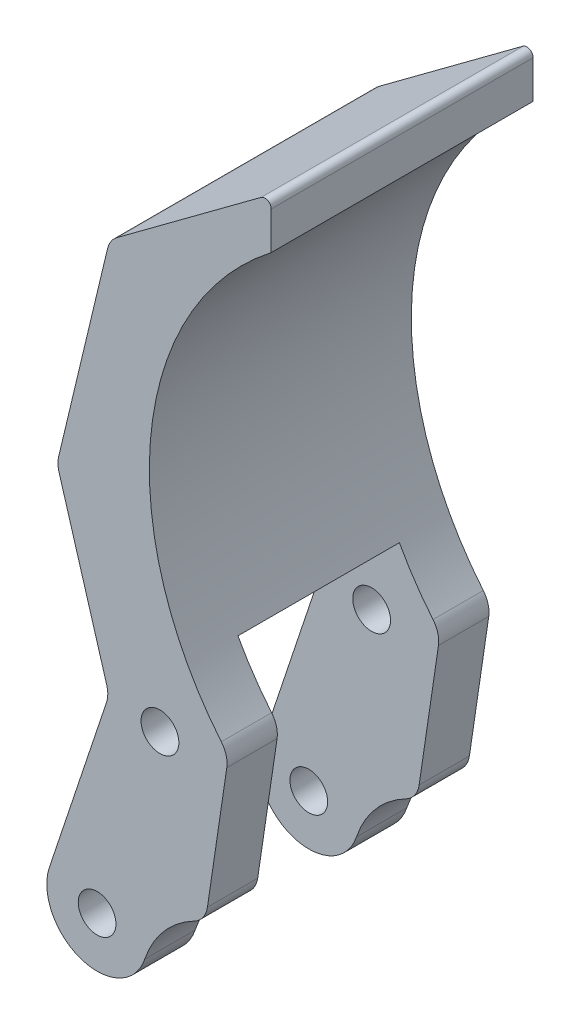
ISO-10303-21;
HEADER;
FILE_DESCRIPTION(('STEP AP214'),'2;1');
FILE_NAME('part.step','',(''),(''),'','','');
FILE_SCHEMA(('AUTOMOTIVE_DESIGN { 1 0 10303 214 1 1 1 1 }'));
ENDSEC;
DATA;
#1=APPLICATION_CONTEXT('core data for automotive mechanical design processes');
#2=APPLICATION_PROTOCOL_DEFINITION('international standard','automotive_design',2000,#1);
#3=PRODUCT_CONTEXT('',#1,'mechanical');
#4=PRODUCT('Part','Part','',(#3));
#5=PRODUCT_RELATED_PRODUCT_CATEGORY('part','',(#4));
#6=PRODUCT_DEFINITION_FORMATION('','',#4);
#7=PRODUCT_DEFINITION_CONTEXT('part definition',#1,'design');
#8=PRODUCT_DEFINITION('design','',#6,#7);
#9=PRODUCT_DEFINITION_SHAPE('','',#8);
#10=(LENGTH_UNIT() NAMED_UNIT(*) SI_UNIT(.MILLI.,.METRE.));
#11=(NAMED_UNIT(*) PLANE_ANGLE_UNIT() SI_UNIT($,.RADIAN.));
#12=(NAMED_UNIT(*) SI_UNIT($,.STERADIAN.) SOLID_ANGLE_UNIT());
#13=UNCERTAINTY_MEASURE_WITH_UNIT(LENGTH_MEASURE(1.E-05),#10,'distance_accuracy_value','');
#14=(GEOMETRIC_REPRESENTATION_CONTEXT(3) GLOBAL_UNCERTAINTY_ASSIGNED_CONTEXT((#13)) GLOBAL_UNIT_ASSIGNED_CONTEXT((#10,
#11,#12)) REPRESENTATION_CONTEXT('',''));
#15=CARTESIAN_POINT('',(0.,0.,0.));
#16=DIRECTION('',(0.,0.,1.));
#17=DIRECTION('',(1.,0.,0.));
#18=AXIS2_PLACEMENT_3D('',#15,#16,#17);
#19=CARTESIAN_POINT('',(9.9580579753652,55.9149215044284,4.));
#20=DIRECTION('',(0.,0.,-1.));
#21=DIRECTION('',(-1.,0.,0.));
#22=AXIS2_PLACEMENT_3D('',#19,#20,#21);
#23=PLANE('',#22);
#24=CARTESIAN_POINT('',(-19.2004680560857,23.2454595039322,4.));
#25=DIRECTION('',(0.,0.,1.));
#26=DIRECTION('',(-1.,0.,0.));
#27=AXIS2_PLACEMENT_3D('',#24,#25,#26);
#28=CIRCLE('',#27,1.5);
#29=CARTESIAN_POINT('',(-20.7004680560857,23.2454595039322,4.));
#30=VERTEX_POINT('',#29);
#31=EDGE_CURVE('E349',#30,#30,#28,.T.);
#32=ORIENTED_EDGE('',*,*,#31,.F.);
#33=EDGE_LOOP('',(#32));
#34=FACE_BOUND('',#33,.T.);
#35=CARTESIAN_POINT('',(9.9580579753652,55.9149215044284,4.));
#36=DIRECTION('',(0.,0.,-1.));
#37=DIRECTION('',(-1.,0.,0.));
#38=AXIS2_PLACEMENT_3D('',#35,#36,#37);
#39=CIRCLE('',#38,25.);
#40=CARTESIAN_POINT('',(-9.31952103003914,39.997165767818,4.));
#41=VERTEX_POINT('',#40);
#42=CARTESIAN_POINT('',(-11.9955270792283,43.9549840777222,4.));
#43=VERTEX_POINT('',#42);
#44=EDGE_CURVE('E355',#41,#43,#39,.T.);
#45=ORIENTED_EDGE('',*,*,#44,.T.);
#46=DIRECTION('',(-0.812970195482713,-0.582305299011437,0.));
#47=VECTOR('',#46,1.);
#48=CARTESIAN_POINT('',(8.17584491950262,58.4031112888528,4.));
#49=LINE('',#48,#47);
#50=CARTESIAN_POINT('',(-18.4315703806583,39.3450461735848,4.));
#51=VERTEX_POINT('',#50);
#52=EDGE_CURVE('E343',#43,#51,#49,.T.);
#53=ORIENTED_EDGE('',*,*,#52,.T.);
#54=CARTESIAN_POINT('',(-20.3485637593588,38.7748388551307,4.));
#55=DIRECTION('',(0.,0.,-1.));
#56=DIRECTION('',(1.,0.,0.));
#57=AXIS2_PLACEMENT_3D('',#54,#55,#56);
#58=CIRCLE('',#57,2.);
#59=CARTESIAN_POINT('',(-18.4511972326077,38.1423831150474,4.));
#60=VERTEX_POINT('',#59);
#61=EDGE_CURVE('E358',#51,#60,#58,.T.);
#62=ORIENTED_EDGE('',*,*,#61,.T.);
#63=DIRECTION('',(-0.316227870041676,-0.948683263375562,0.));
#64=VECTOR('',#63,1.);
#65=CARTESIAN_POINT('',(-22.995202754365,24.5103715323581,4.));
#66=LINE('',#65,#64);
#67=CARTESIAN_POINT('',(-22.995202754365,24.5103715323581,4.));
#68=VERTEX_POINT('',#67);
#69=EDGE_CURVE('E361',#60,#68,#66,.T.);
#70=ORIENTED_EDGE('',*,*,#69,.T.);
#71=CARTESIAN_POINT('',(-19.2004680560857,23.2454595039322,4.));
#72=DIRECTION('',(0.,0.,1.));
#73=DIRECTION('',(1.,0.,0.));
#74=AXIS2_PLACEMENT_3D('',#71,#72,#73);
#75=CIRCLE('',#74,4.00000173374733);
#76=CARTESIAN_POINT('',(-15.4057333578063,21.9805474755062,4.));
#77=VERTEX_POINT('',#76);
#78=EDGE_CURVE('E363',#68,#77,#75,.T.);
#79=ORIENTED_EDGE('',*,*,#78,.T.);
#80=CARTESIAN_POINT('',(-7.81626725080184,19.4507245151728,4.));
#81=DIRECTION('',(0.,0.,-1.));
#82=DIRECTION('',(-1.,0.,0.));
#83=AXIS2_PLACEMENT_3D('',#80,#81,#82);
#84=CIRCLE('',#83,8.);
#85=CARTESIAN_POINT('',(-11.4848022519829,26.5600037293485,4.));
#86=VERTEX_POINT('',#85);
#87=EDGE_CURVE('E365',#77,#86,#84,.T.);
#88=ORIENTED_EDGE('',*,*,#87,.T.);
#89=CARTESIAN_POINT('',(-12.4019360022781,28.3373235328924,4.));
#90=DIRECTION('',(0.,0.,1.));
#91=DIRECTION('',(1.,0.,0.));
#92=AXIS2_PLACEMENT_3D('',#89,#90,#91);
#93=CIRCLE('',#92,2.);
#94=CARTESIAN_POINT('',(-10.4235699497073,28.0439504563578,4.));
#95=VERTEX_POINT('',#94);
#96=EDGE_CURVE('E367',#86,#95,#93,.T.);
#97=ORIENTED_EDGE('',*,*,#96,.T.);
#98=DIRECTION('',(0.146686538267296,0.989183026285407,0.));
#99=VECTOR('',#98,1.);
#100=CARTESIAN_POINT('',(-8.88336129790067,38.4303722323546,4.));
#101=LINE('',#100,#99);
#102=CARTESIAN_POINT('',(-8.88336129790067,38.4303722323546,4.));
#103=VERTEX_POINT('',#102);
#104=EDGE_CURVE('E369',#95,#103,#101,.T.);
#105=ORIENTED_EDGE('',*,*,#104,.T.);
#106=CARTESIAN_POINT('',(-10.8617273504715,38.7237453088892,4.));
#107=DIRECTION('',(0.,0.,1.));
#108=DIRECTION('',(1.,0.,0.));
#109=AXIS2_PLACEMENT_3D('',#106,#107,#108);
#110=CIRCLE('',#109,2.);
#111=EDGE_CURVE('E371',#103,#41,#110,.T.);
#112=ORIENTED_EDGE('',*,*,#111,.T.);
#113=EDGE_LOOP('',(#45,#53,#62,#70,#79,#88,#97,#105,#112));
#114=FACE_BOUND('',#113,.T.);
#115=CARTESIAN_POINT('',(-12.7464035969963,38.6307904465876,4.));
#116=DIRECTION('',(0.,0.,-1.));
#117=DIRECTION('',(-1.,0.,0.));
#118=AXIS2_PLACEMENT_3D('',#115,#116,#117);
#119=CIRCLE('',#118,0.00425509357768195);
#120=CARTESIAN_POINT('',(-12.7454023071672,38.6266548402194,4.));
#121=VERTEX_POINT('',#120);
#122=CARTESIAN_POINT('',(-12.7475817780685,38.6348791763067,4.));
#123=VERTEX_POINT('',#122);
#124=EDGE_CURVE('E53',#121,#123,#119,.T.);
#125=ORIENTED_EDGE('',*,*,#124,.F.);
#126=CARTESIAN_POINT('',(-14.2004680560857,38.2454595039322,4.));
#127=DIRECTION('',(0.,0.,-1.));
#128=DIRECTION('',(-1.,0.,0.));
#129=AXIS2_PLACEMENT_3D('',#126,#127,#128);
#130=CIRCLE('',#129,1.50416961080948);
#131=EDGE_CURVE('E249',#121,#123,#130,.T.);
#132=ORIENTED_EDGE('',*,*,#131,.T.);
#133=EDGE_LOOP('',(#125,#132));
#134=FACE_BOUND('',#133,.T.);
#135=ADVANCED_FACE('F37',(#34,#114,#134),#23,.F.);
#136=CARTESIAN_POINT('',(9.9580579753652,55.9149215044284,0.));
#137=DIRECTION('',(0.,0.,-1.));
#138=DIRECTION('',(-1.,0.,0.));
#139=AXIS2_PLACEMENT_3D('',#136,#137,#138);
#140=PLANE('',#139);
#141=CARTESIAN_POINT('',(-20.3485637593588,38.7748388551307,0.));
#142=DIRECTION('',(0.,0.,-1.));
#143=DIRECTION('',(1.,0.,0.));
#144=AXIS2_PLACEMENT_3D('',#141,#142,#143);
#145=CIRCLE('',#144,2.);
#146=CARTESIAN_POINT('',(-18.4315703806583,39.3450461735848,0.));
#147=VERTEX_POINT('',#146);
#148=CARTESIAN_POINT('',(-18.4511972326077,38.1423831150474,0.));
#149=VERTEX_POINT('',#148);
#150=EDGE_CURVE('E389',#147,#149,#145,.T.);
#151=ORIENTED_EDGE('',*,*,#150,.F.);
#152=DIRECTION('',(0.285103659227046,-0.958496689350228,0.));
#153=VECTOR('',#152,1.);
#154=CARTESIAN_POINT('',(-18.4315703806583,39.3450461735848,0.));
#155=LINE('',#154,#153);
#156=CARTESIAN_POINT('',(-22.2330011720339,52.1251656508512,0.));
#157=VERTEX_POINT('',#156);
#158=EDGE_CURVE('E387',#157,#147,#155,.T.);
#159=ORIENTED_EDGE('',*,*,#158,.F.);
#160=CARTESIAN_POINT('',(-20.3160077933335,52.6953729693053,0.));
#161=DIRECTION('',(0.,0.,1.));
#162=DIRECTION('',(-1.,0.,0.));
#163=AXIS2_PLACEMENT_3D('',#160,#161,#162);
#164=CIRCLE('',#163,2.);
#165=CARTESIAN_POINT('',(-22.2612764174017,53.1600556354505,0.));
#166=VERTEX_POINT('',#165);
#167=EDGE_CURVE('E385',#166,#157,#164,.T.);
#168=ORIENTED_EDGE('',*,*,#167,.F.);
#169=DIRECTION('',(-0.232341333072594,-0.972634312034102,0.));
#170=VECTOR('',#169,1.);
#171=CARTESIAN_POINT('',(-22.2612764174017,53.1600556354505,0.));
#172=LINE('',#171,#170);
#173=CARTESIAN_POINT('',(-18.3727744260816,69.4382202183709,0.));
#174=VERTEX_POINT('',#173);
#175=EDGE_CURVE('E383',#174,#166,#172,.T.);
#176=ORIENTED_EDGE('',*,*,#175,.F.);
#177=CARTESIAN_POINT('',(-16.4275058020134,68.9735375522257,0.));
#178=DIRECTION('',(0.,0.,1.));
#179=DIRECTION('',(-1.,0.,0.));
#180=AXIS2_PLACEMENT_3D('',#177,#178,#179);
#181=CIRCLE('',#180,2.);
#182=CARTESIAN_POINT('',(-17.6189757616203,70.5798996955029,0.));
#183=VERTEX_POINT('',#182);
#184=EDGE_CURVE('E381',#183,#174,#181,.T.);
#185=ORIENTED_EDGE('',*,*,#184,.F.);
#186=DIRECTION('',(-0.803181071638629,-0.595734979803455,0.));
#187=VECTOR('',#186,1.);
#188=CARTESIAN_POINT('',(-17.6189757616203,70.5798996955029,0.));
#189=LINE('',#188,#187);
#190=CARTESIAN_POINT('',(-6.15061411090899,79.0862059788751,0.));
#191=VERTEX_POINT('',#190);
#192=EDGE_CURVE('E379',#191,#183,#189,.T.);
#193=ORIENTED_EDGE('',*,*,#192,.F.);
#194=CARTESIAN_POINT('',(-5.85274662100727,78.6846154430558,0.));
#195=DIRECTION('',(0.,0.,1.));
#196=DIRECTION('',(-1.,0.,0.));
#197=AXIS2_PLACEMENT_3D('',#194,#195,#196);
#198=CIRCLE('',#197,0.499999999999991);
#199=CARTESIAN_POINT('',(-5.35274662100727,78.6846154430558,0.));
#200=VERTEX_POINT('',#199);
#201=EDGE_CURVE('E377',#200,#191,#198,.T.);
#202=ORIENTED_EDGE('',*,*,#201,.F.);
#203=DIRECTION('',(0.,1.,0.));
#204=VECTOR('',#203,1.);
#205=CARTESIAN_POINT('',(-5.35274662100727,78.6846154430558,0.));
#206=LINE('',#205,#204);
#207=CARTESIAN_POINT('',(-5.35274662100727,75.677999772039,0.));
#208=VERTEX_POINT('',#207);
#209=EDGE_CURVE('E375',#208,#200,#206,.T.);
#210=ORIENTED_EDGE('',*,*,#209,.F.);
#211=CARTESIAN_POINT('',(9.9580579753652,55.9149215044284,0.));
#212=DIRECTION('',(0.,0.,-1.));
#213=DIRECTION('',(-1.,0.,0.));
#214=AXIS2_PLACEMENT_3D('',#211,#212,#213);
#215=CIRCLE('',#214,25.);
#216=CARTESIAN_POINT('',(-9.31952103003914,39.997165767818,0.));
#217=VERTEX_POINT('',#216);
#218=EDGE_CURVE('E352',#217,#208,#215,.T.);
#219=ORIENTED_EDGE('',*,*,#218,.F.);
#220=CARTESIAN_POINT('',(-10.8617273504715,38.7237453088892,0.));
#221=DIRECTION('',(0.,0.,1.));
#222=DIRECTION('',(1.,0.,0.));
#223=AXIS2_PLACEMENT_3D('',#220,#221,#222);
#224=CIRCLE('',#223,2.);
#225=CARTESIAN_POINT('',(-8.88336129790067,38.4303722323546,0.));
#226=VERTEX_POINT('',#225);
#227=EDGE_CURVE('E359',#226,#217,#224,.T.);
#228=ORIENTED_EDGE('',*,*,#227,.F.);
#229=DIRECTION('',(0.146686538267296,0.989183026285407,0.));
#230=VECTOR('',#229,1.);
#231=CARTESIAN_POINT('',(-8.88336129790067,38.4303722323546,0.));
#232=LINE('',#231,#230);
#233=CARTESIAN_POINT('',(-10.4235699497073,28.0439504563578,0.));
#234=VERTEX_POINT('',#233);
#235=EDGE_CURVE('E399',#234,#226,#232,.T.);
#236=ORIENTED_EDGE('',*,*,#235,.F.);
#237=CARTESIAN_POINT('',(-12.4019360022781,28.3373235328924,0.));
#238=DIRECTION('',(0.,0.,1.));
#239=DIRECTION('',(1.,0.,0.));
#240=AXIS2_PLACEMENT_3D('',#237,#238,#239);
#241=CIRCLE('',#240,2.);
#242=CARTESIAN_POINT('',(-11.4848022519829,26.5600037293485,0.));
#243=VERTEX_POINT('',#242);
#244=EDGE_CURVE('E397',#243,#234,#241,.T.);
#245=ORIENTED_EDGE('',*,*,#244,.F.);
#246=CARTESIAN_POINT('',(-7.81626725080184,19.4507245151728,0.));
#247=DIRECTION('',(0.,0.,-1.));
#248=DIRECTION('',(-1.,0.,0.));
#249=AXIS2_PLACEMENT_3D('',#246,#247,#248);
#250=CIRCLE('',#249,8.);
#251=CARTESIAN_POINT('',(-15.4057333578063,21.9805474755062,0.));
#252=VERTEX_POINT('',#251);
#253=EDGE_CURVE('E395',#252,#243,#250,.T.);
#254=ORIENTED_EDGE('',*,*,#253,.F.);
#255=CARTESIAN_POINT('',(-19.2004680560857,23.2454595039322,0.));
#256=DIRECTION('',(0.,0.,1.));
#257=DIRECTION('',(1.,0.,0.));
#258=AXIS2_PLACEMENT_3D('',#255,#256,#257);
#259=CIRCLE('',#258,4.00000173374733);
#260=CARTESIAN_POINT('',(-22.995202754365,24.5103715323581,0.));
#261=VERTEX_POINT('',#260);
#262=EDGE_CURVE('E393',#261,#252,#259,.T.);
#263=ORIENTED_EDGE('',*,*,#262,.F.);
#264=DIRECTION('',(-0.316227870041676,-0.948683263375562,0.));
#265=VECTOR('',#264,1.);
#266=CARTESIAN_POINT('',(-22.995202754365,24.5103715323581,0.));
#267=LINE('',#266,#265);
#268=EDGE_CURVE('E391',#149,#261,#267,.T.);
#269=ORIENTED_EDGE('',*,*,#268,.F.);
#270=EDGE_LOOP('',(#151,#159,#168,#176,#185,#193,#202,#210,#219,#228,#236,#245,#254,#263,#269));
#271=FACE_BOUND('',#270,.T.);
#272=CARTESIAN_POINT('',(-19.2004680560857,23.2454595039322,0.));
#273=DIRECTION('',(0.,0.,1.));
#274=DIRECTION('',(-1.,0.,0.));
#275=AXIS2_PLACEMENT_3D('',#272,#273,#274);
#276=CIRCLE('',#275,1.5);
#277=CARTESIAN_POINT('',(-20.7004680560857,23.2454595039322,0.));
#278=VERTEX_POINT('',#277);
#279=EDGE_CURVE('E348',#278,#278,#276,.T.);
#280=ORIENTED_EDGE('',*,*,#279,.T.);
#281=EDGE_LOOP('',(#280));
#282=FACE_BOUND('',#281,.T.);
#283=CARTESIAN_POINT('',(-14.2004680560857,38.2454595039322,0.));
#284=DIRECTION('',(0.,0.,-1.));
#285=DIRECTION('',(-1.,0.,0.));
#286=AXIS2_PLACEMENT_3D('',#283,#284,#285);
#287=CIRCLE('',#286,1.50416961080948);
#288=CARTESIAN_POINT('',(-12.7454023071672,38.6266548402194,0.));
#289=VERTEX_POINT('',#288);
#290=CARTESIAN_POINT('',(-12.7475817780685,38.6348791763067,0.));
#291=VERTEX_POINT('',#290);
#292=EDGE_CURVE('E241',#289,#291,#287,.T.);
#293=ORIENTED_EDGE('',*,*,#292,.F.);
#294=CARTESIAN_POINT('',(-12.7464035969963,38.6307904465876,0.));
#295=DIRECTION('',(0.,0.,-1.));
#296=DIRECTION('',(-1.,0.,0.));
#297=AXIS2_PLACEMENT_3D('',#294,#295,#296);
#298=CIRCLE('',#297,0.00425509357768195);
#299=EDGE_CURVE('E58',#289,#291,#298,.T.);
#300=ORIENTED_EDGE('',*,*,#299,.T.);
#301=EDGE_LOOP('',(#293,#300));
#302=FACE_BOUND('',#301,.T.);
#303=ADVANCED_FACE('F458',(#271,#282,#302),#140,.T.);
#304=CARTESIAN_POINT('',(9.95805797536526,55.9149215044284,20.84));
#305=DIRECTION('',(0.,0.,1.));
#306=DIRECTION('',(1.,0.,0.));
#307=AXIS2_PLACEMENT_3D('',#304,#305,#306);
#308=PLANE('',#307);
#309=CARTESIAN_POINT('',(-19.2004680560857,23.2454595039322,20.84));
#310=DIRECTION('',(0.,0.,-1.));
#311=DIRECTION('',(-1.,0.,0.));
#312=AXIS2_PLACEMENT_3D('',#309,#310,#311);
#313=CIRCLE('',#312,1.5);
#314=CARTESIAN_POINT('',(-20.7004680560857,23.2454595039322,20.84));
#315=VERTEX_POINT('',#314);
#316=EDGE_CURVE('E246',#315,#315,#313,.T.);
#317=ORIENTED_EDGE('',*,*,#316,.T.);
#318=EDGE_LOOP('',(#317));
#319=FACE_BOUND('',#318,.T.);
#320=CARTESIAN_POINT('',(9.95805797536526,55.9149215044284,20.84));
#321=DIRECTION('',(0.,0.,1.));
#322=DIRECTION('',(1.,0.,0.));
#323=AXIS2_PLACEMENT_3D('',#320,#321,#322);
#324=CIRCLE('',#323,25.0000000000001);
#325=CARTESIAN_POINT('',(-5.35274662100728,75.677999772039,20.84));
#326=VERTEX_POINT('',#325);
#327=CARTESIAN_POINT('',(-9.31952103003914,39.997165767818,20.84));
#328=VERTEX_POINT('',#327);
#329=EDGE_CURVE('E305',#326,#328,#324,.T.);
#330=ORIENTED_EDGE('',*,*,#329,.F.);
#331=DIRECTION('',(0.,-1.,0.));
#332=VECTOR('',#331,1.);
#333=CARTESIAN_POINT('',(-5.35274662100727,78.6846154430558,20.84));
#334=LINE('',#333,#332);
#335=CARTESIAN_POINT('',(-5.35274662100727,78.6846154430558,20.84));
#336=VERTEX_POINT('',#335);
#337=EDGE_CURVE('E336',#336,#326,#334,.T.);
#338=ORIENTED_EDGE('',*,*,#337,.F.);
#339=CARTESIAN_POINT('',(-5.85274662100727,78.6846154430558,20.84));
#340=DIRECTION('',(0.,0.,-1.));
#341=DIRECTION('',(-1.,0.,0.));
#342=AXIS2_PLACEMENT_3D('',#339,#340,#341);
#343=CIRCLE('',#342,0.499999999999998);
#344=CARTESIAN_POINT('',(-6.150614110909,79.0862059788751,20.84));
#345=VERTEX_POINT('',#344);
#346=EDGE_CURVE('E333',#345,#336,#343,.T.);
#347=ORIENTED_EDGE('',*,*,#346,.F.);
#348=DIRECTION('',(0.803181071638628,0.595734979803456,0.));
#349=VECTOR('',#348,1.);
#350=CARTESIAN_POINT('',(-17.6189757616203,70.5798996955029,20.84));
#351=LINE('',#350,#349);
#352=CARTESIAN_POINT('',(-17.6189757616203,70.5798996955029,20.84));
#353=VERTEX_POINT('',#352);
#354=EDGE_CURVE('E330',#353,#345,#351,.T.);
#355=ORIENTED_EDGE('',*,*,#354,.F.);
#356=CARTESIAN_POINT('',(-16.4275058020134,68.9735375522257,20.84));
#357=DIRECTION('',(0.,0.,-1.));
#358=DIRECTION('',(-1.,0.,0.));
#359=AXIS2_PLACEMENT_3D('',#356,#357,#358);
#360=CIRCLE('',#359,2.);
#361=CARTESIAN_POINT('',(-18.3727744260816,69.4382202183709,20.84));
#362=VERTEX_POINT('',#361);
#363=EDGE_CURVE('E327',#362,#353,#360,.T.);
#364=ORIENTED_EDGE('',*,*,#363,.F.);
#365=DIRECTION('',(0.232341333072594,0.972634312034102,0.));
#366=VECTOR('',#365,1.);
#367=CARTESIAN_POINT('',(-22.2612764174017,53.1600556354505,20.84));
#368=LINE('',#367,#366);
#369=CARTESIAN_POINT('',(-22.2612764174017,53.1600556354505,20.84));
#370=VERTEX_POINT('',#369);
#371=EDGE_CURVE('E324',#370,#362,#368,.T.);
#372=ORIENTED_EDGE('',*,*,#371,.F.);
#373=CARTESIAN_POINT('',(-20.3160077933335,52.6953729693053,20.84));
#374=DIRECTION('',(0.,0.,-1.));
#375=DIRECTION('',(-1.,0.,0.));
#376=AXIS2_PLACEMENT_3D('',#373,#374,#375);
#377=CIRCLE('',#376,2.);
#378=CARTESIAN_POINT('',(-22.2330011720339,52.1251656508512,20.84));
#379=VERTEX_POINT('',#378);
#380=EDGE_CURVE('E321',#379,#370,#377,.T.);
#381=ORIENTED_EDGE('',*,*,#380,.F.);
#382=DIRECTION('',(-0.285103659227046,0.958496689350228,0.));
#383=VECTOR('',#382,1.);
#384=CARTESIAN_POINT('',(-18.4315703806583,39.3450461735848,20.84));
#385=LINE('',#384,#383);
#386=CARTESIAN_POINT('',(-18.4315703806583,39.3450461735848,20.84));
#387=VERTEX_POINT('',#386);
#388=EDGE_CURVE('E318',#387,#379,#385,.T.);
#389=ORIENTED_EDGE('',*,*,#388,.F.);
#390=CARTESIAN_POINT('',(-20.3485637593588,38.7748388551307,20.84));
#391=DIRECTION('',(0.,0.,-1.));
#392=DIRECTION('',(1.,0.,0.));
#393=AXIS2_PLACEMENT_3D('',#390,#391,#392);
#394=CIRCLE('',#393,2.);
#395=CARTESIAN_POINT('',(-18.4511972326077,38.1423831150474,20.84));
#396=VERTEX_POINT('',#395);
#397=EDGE_CURVE('E254',#387,#396,#394,.T.);
#398=ORIENTED_EDGE('',*,*,#397,.T.);
#399=DIRECTION('',(-0.316227870041676,-0.948683263375562,0.));
#400=VECTOR('',#399,1.);
#401=CARTESIAN_POINT('',(-18.4511972326077,38.1423831150474,20.84));
#402=LINE('',#401,#400);
#403=CARTESIAN_POINT('',(-22.995202754365,24.5103715323581,20.84));
#404=VERTEX_POINT('',#403);
#405=EDGE_CURVE('E285',#396,#404,#402,.T.);
#406=ORIENTED_EDGE('',*,*,#405,.T.);
#407=CARTESIAN_POINT('',(-19.2004680560857,23.2454595039322,20.84));
#408=DIRECTION('',(0.,0.,1.));
#409=DIRECTION('',(1.,0.,0.));
#410=AXIS2_PLACEMENT_3D('',#407,#408,#409);
#411=CIRCLE('',#410,4.00000173374733);
#412=CARTESIAN_POINT('',(-15.4057333578063,21.9805474755062,20.84));
#413=VERTEX_POINT('',#412);
#414=EDGE_CURVE('E288',#404,#413,#411,.T.);
#415=ORIENTED_EDGE('',*,*,#414,.T.);
#416=CARTESIAN_POINT('',(-7.81626725080184,19.4507245151728,20.84));
#417=DIRECTION('',(0.,0.,-1.));
#418=DIRECTION('',(1.,0.,0.));
#419=AXIS2_PLACEMENT_3D('',#416,#417,#418);
#420=CIRCLE('',#419,8.);
#421=CARTESIAN_POINT('',(-11.4848022519829,26.5600037293485,20.84));
#422=VERTEX_POINT('',#421);
#423=EDGE_CURVE('E291',#413,#422,#420,.T.);
#424=ORIENTED_EDGE('',*,*,#423,.T.);
#425=CARTESIAN_POINT('',(-12.4019360022781,28.3373235328924,20.84));
#426=DIRECTION('',(0.,0.,1.));
#427=DIRECTION('',(1.,0.,0.));
#428=AXIS2_PLACEMENT_3D('',#425,#426,#427);
#429=CIRCLE('',#428,2.);
#430=CARTESIAN_POINT('',(-10.4235699497073,28.0439504563578,20.84));
#431=VERTEX_POINT('',#430);
#432=EDGE_CURVE('E294',#422,#431,#429,.T.);
#433=ORIENTED_EDGE('',*,*,#432,.T.);
#434=DIRECTION('',(0.146686538267297,0.989183026285407,0.));
#435=VECTOR('',#434,1.);
#436=CARTESIAN_POINT('',(-10.4235699497073,28.0439504563578,20.84));
#437=LINE('',#436,#435);
#438=CARTESIAN_POINT('',(-8.88336129790067,38.4303722323546,20.84));
#439=VERTEX_POINT('',#438);
#440=EDGE_CURVE('E297',#431,#439,#437,.T.);
#441=ORIENTED_EDGE('',*,*,#440,.T.);
#442=CARTESIAN_POINT('',(-10.8617273504715,38.7237453088892,20.84));
#443=DIRECTION('',(0.,0.,1.));
#444=DIRECTION('',(1.,0.,0.));
#445=AXIS2_PLACEMENT_3D('',#442,#443,#444);
#446=CIRCLE('',#445,2.);
#447=EDGE_CURVE('E259',#439,#328,#446,.T.);
#448=ORIENTED_EDGE('',*,*,#447,.T.);
#449=EDGE_LOOP('',(#330,#338,#347,#355,#364,#372,#381,#389,#398,#406,#415,#424,#433,#441,#448));
#450=FACE_BOUND('',#449,.T.);
#451=CARTESIAN_POINT('',(-14.2004680560857,38.2454595039322,20.84));
#452=DIRECTION('',(0.,0.,-1.));
#453=DIRECTION('',(-1.,0.,0.));
#454=AXIS2_PLACEMENT_3D('',#451,#452,#453);
#455=CIRCLE('',#454,1.50416961080948);
#456=CARTESIAN_POINT('',(-12.7454023071672,38.6266548402194,20.84));
#457=VERTEX_POINT('',#456);
#458=CARTESIAN_POINT('',(-12.7475817780685,38.6348791763067,20.84));
#459=VERTEX_POINT('',#458);
#460=EDGE_CURVE('E235',#457,#459,#455,.T.);
#461=ORIENTED_EDGE('',*,*,#460,.T.);
#462=CARTESIAN_POINT('',(-12.7464035969963,38.6307904465876,20.84));
#463=DIRECTION('',(0.,0.,-1.));
#464=DIRECTION('',(-1.,0.,0.));
#465=AXIS2_PLACEMENT_3D('',#462,#463,#464);
#466=CIRCLE('',#465,0.00425509357768195);
#467=EDGE_CURVE('E227',#457,#459,#466,.T.);
#468=ORIENTED_EDGE('',*,*,#467,.F.);
#469=EDGE_LOOP('',(#461,#468));
#470=FACE_BOUND('',#469,.T.);
#471=ADVANCED_FACE('F240',(#319,#450,#470),#308,.T.);
#472=CARTESIAN_POINT('',(9.9580579753652,55.9149215044284,16.84));
#473=DIRECTION('',(0.,0.,1.));
#474=DIRECTION('',(1.,0.,0.));
#475=AXIS2_PLACEMENT_3D('',#472,#473,#474);
#476=PLANE('',#475);
#477=CARTESIAN_POINT('',(-19.2004680560857,23.2454595039322,16.84));
#478=DIRECTION('',(0.,0.,1.));
#479=DIRECTION('',(1.,0.,0.));
#480=AXIS2_PLACEMENT_3D('',#477,#478,#479);
#481=CIRCLE('',#480,1.5);
#482=CARTESIAN_POINT('',(-17.7004680560857,23.2454595039322,16.84));
#483=VERTEX_POINT('',#482);
#484=EDGE_CURVE('E41',#483,#483,#481,.T.);
#485=ORIENTED_EDGE('',*,*,#484,.T.);
#486=EDGE_LOOP('',(#485));
#487=FACE_BOUND('',#486,.T.);
#488=CARTESIAN_POINT('',(9.9580579753652,55.9149215044284,16.84));
#489=DIRECTION('',(0.,0.,-1.));
#490=DIRECTION('',(1.,0.,0.));
#491=AXIS2_PLACEMENT_3D('',#488,#489,#490);
#492=CIRCLE('',#491,25.);
#493=CARTESIAN_POINT('',(-9.31952103003914,39.997165767818,16.84));
#494=VERTEX_POINT('',#493);
#495=CARTESIAN_POINT('',(-11.9955270792283,43.9549840777222,16.84));
#496=VERTEX_POINT('',#495);
#497=EDGE_CURVE('E255',#494,#496,#492,.T.);
#498=ORIENTED_EDGE('',*,*,#497,.F.);
#499=CARTESIAN_POINT('',(-10.8617273504715,38.7237453088892,16.84));
#500=DIRECTION('',(0.,0.,1.));
#501=DIRECTION('',(1.,0.,0.));
#502=AXIS2_PLACEMENT_3D('',#499,#500,#501);
#503=CIRCLE('',#502,2.);
#504=CARTESIAN_POINT('',(-8.88336129790067,38.4303722323546,16.84));
#505=VERTEX_POINT('',#504);
#506=EDGE_CURVE('E279',#505,#494,#503,.T.);
#507=ORIENTED_EDGE('',*,*,#506,.F.);
#508=DIRECTION('',(0.146686538267297,0.989183026285407,0.));
#509=VECTOR('',#508,1.);
#510=CARTESIAN_POINT('',(-10.4235699497073,28.0439504563578,16.84));
#511=LINE('',#510,#509);
#512=CARTESIAN_POINT('',(-10.4235699497073,28.0439504563578,16.84));
#513=VERTEX_POINT('',#512);
#514=EDGE_CURVE('E276',#513,#505,#511,.T.);
#515=ORIENTED_EDGE('',*,*,#514,.F.);
#516=CARTESIAN_POINT('',(-12.4019360022781,28.3373235328924,16.84));
#517=DIRECTION('',(0.,0.,1.));
#518=DIRECTION('',(1.,0.,0.));
#519=AXIS2_PLACEMENT_3D('',#516,#517,#518);
#520=CIRCLE('',#519,2.);
#521=CARTESIAN_POINT('',(-11.4848022519829,26.5600037293485,16.84));
#522=VERTEX_POINT('',#521);
#523=EDGE_CURVE('E273',#522,#513,#520,.T.);
#524=ORIENTED_EDGE('',*,*,#523,.F.);
#525=CARTESIAN_POINT('',(-7.81626725080184,19.4507245151728,16.84));
#526=DIRECTION('',(0.,0.,-1.));
#527=DIRECTION('',(1.,0.,0.));
#528=AXIS2_PLACEMENT_3D('',#525,#526,#527);
#529=CIRCLE('',#528,8.);
#530=CARTESIAN_POINT('',(-15.4057333578063,21.9805474755062,16.84));
#531=VERTEX_POINT('',#530);
#532=EDGE_CURVE('E270',#531,#522,#529,.T.);
#533=ORIENTED_EDGE('',*,*,#532,.F.);
#534=CARTESIAN_POINT('',(-19.2004680560857,23.2454595039322,16.84));
#535=DIRECTION('',(0.,0.,1.));
#536=DIRECTION('',(1.,0.,0.));
#537=AXIS2_PLACEMENT_3D('',#534,#535,#536);
#538=CIRCLE('',#537,4.00000173374733);
#539=CARTESIAN_POINT('',(-22.995202754365,24.5103715323581,16.84));
#540=VERTEX_POINT('',#539);
#541=EDGE_CURVE('E267',#540,#531,#538,.T.);
#542=ORIENTED_EDGE('',*,*,#541,.F.);
#543=DIRECTION('',(-0.316227870041676,-0.948683263375562,0.));
#544=VECTOR('',#543,1.);
#545=CARTESIAN_POINT('',(-18.4511972326077,38.1423831150474,16.84));
#546=LINE('',#545,#544);
#547=CARTESIAN_POINT('',(-18.4511972326077,38.1423831150474,16.84));
#548=VERTEX_POINT('',#547);
#549=EDGE_CURVE('E264',#548,#540,#546,.T.);
#550=ORIENTED_EDGE('',*,*,#549,.F.);
#551=CARTESIAN_POINT('',(-20.3485637593588,38.7748388551307,16.84));
#552=DIRECTION('',(0.,0.,-1.));
#553=DIRECTION('',(1.,0.,0.));
#554=AXIS2_PLACEMENT_3D('',#551,#552,#553);
#555=CIRCLE('',#554,2.);
#556=CARTESIAN_POINT('',(-18.4315703806583,39.3450461735848,16.84));
#557=VERTEX_POINT('',#556);
#558=EDGE_CURVE('E261',#557,#548,#555,.T.);
#559=ORIENTED_EDGE('',*,*,#558,.F.);
#560=DIRECTION('',(-0.812970195482713,-0.582305299011438,0.));
#561=VECTOR('',#560,1.);
#562=CARTESIAN_POINT('',(-11.9955270792283,43.9549840777222,16.84));
#563=LINE('',#562,#561);
#564=EDGE_CURVE('E258',#496,#557,#563,.T.);
#565=ORIENTED_EDGE('',*,*,#564,.F.);
#566=EDGE_LOOP('',(#498,#507,#515,#524,#533,#542,#550,#559,#565));
#567=FACE_BOUND('',#566,.T.);
#568=CARTESIAN_POINT('',(-12.7464035969963,38.6307904465876,16.84));
#569=DIRECTION('',(0.,0.,1.));
#570=DIRECTION('',(1.,0.,0.));
#571=AXIS2_PLACEMENT_3D('',#568,#569,#570);
#572=CIRCLE('',#571,0.00425509357768195);
#573=CARTESIAN_POINT('',(-12.7475817780685,38.6348791763067,16.84));
#574=VERTEX_POINT('',#573);
#575=CARTESIAN_POINT('',(-12.7454023071672,38.6266548402194,16.84));
#576=VERTEX_POINT('',#575);
#577=EDGE_CURVE('E11',#574,#576,#572,.T.);
#578=ORIENTED_EDGE('',*,*,#577,.F.);
#579=CARTESIAN_POINT('',(-14.2004680560857,38.2454595039322,16.84));
#580=DIRECTION('',(0.,0.,1.));
#581=DIRECTION('',(1.,0.,0.));
#582=AXIS2_PLACEMENT_3D('',#579,#580,#581);
#583=CIRCLE('',#582,1.50416961080948);
#584=EDGE_CURVE('E46',#574,#576,#583,.T.);
#585=ORIENTED_EDGE('',*,*,#584,.T.);
#586=EDGE_LOOP('',(#578,#585));
#587=FACE_BOUND('',#586,.T.);
#588=ADVANCED_FACE('F447',(#487,#567,#587),#476,.F.);
#589=CARTESIAN_POINT('',(-18.4315703806583,39.3450461735848,20.84));
#590=DIRECTION('',(0.582305299011437,-0.812970195482713,0.));
#591=DIRECTION('',(0.812970195482713,0.582305299011437,0.));
#592=AXIS2_PLACEMENT_3D('',#589,#590,#591);
#593=PLANE('',#592);
#594=DIRECTION('',(0.,0.,-1.));
#595=VECTOR('',#594,1.);
#596=CARTESIAN_POINT('',(-11.9955270792283,43.9549840777222,20.84));
#597=LINE('',#596,#595);
#598=EDGE_CURVE('E339',#496,#43,#597,.T.);
#599=ORIENTED_EDGE('',*,*,#598,.F.);
#600=ORIENTED_EDGE('',*,*,#564,.T.);
#601=DIRECTION('',(0.,0.,-1.));
#602=VECTOR('',#601,1.);
#603=CARTESIAN_POINT('',(-18.4315703806583,39.3450461735848,20.84));
#604=LINE('',#603,#602);
#605=EDGE_CURVE('E344',#557,#51,#604,.T.);
#606=ORIENTED_EDGE('',*,*,#605,.T.);
#607=ORIENTED_EDGE('',*,*,#52,.F.);
#608=EDGE_LOOP('',(#599,#600,#606,#607));
#609=FACE_BOUND('',#608,.T.);
#610=ADVANCED_FACE('F449',(#609),#593,.T.);
#611=CARTESIAN_POINT('',(9.9580579753652,55.9149215044284,4.));
#612=DIRECTION('',(0.,0.,-1.));
#613=DIRECTION('',(-1.,0.,0.));
#614=AXIS2_PLACEMENT_3D('',#611,#612,#613);
#615=CYLINDRICAL_SURFACE('',#614,25.);
#616=ORIENTED_EDGE('',*,*,#218,.T.);
#617=DIRECTION('',(0.,0.,-1.));
#618=VECTOR('',#617,1.);
#619=CARTESIAN_POINT('',(-5.35274662100727,75.677999772039,4.));
#620=LINE('',#619,#618);
#621=EDGE_CURVE('E443',#326,#208,#620,.T.);
#622=ORIENTED_EDGE('',*,*,#621,.F.);
#623=ORIENTED_EDGE('',*,*,#329,.T.);
#624=DIRECTION('',(0.,0.,1.));
#625=VECTOR('',#624,1.);
#626=CARTESIAN_POINT('',(-9.31952103003914,39.997165767818,16.84));
#627=LINE('',#626,#625);
#628=EDGE_CURVE('E302',#494,#328,#627,.T.);
#629=ORIENTED_EDGE('',*,*,#628,.F.);
#630=ORIENTED_EDGE('',*,*,#497,.T.);
#631=ORIENTED_EDGE('',*,*,#598,.T.);
#632=ORIENTED_EDGE('',*,*,#44,.F.);
#633=DIRECTION('',(0.,0.,-1.));
#634=VECTOR('',#633,1.);
#635=CARTESIAN_POINT('',(-9.31952103003914,39.997165767818,4.));
#636=LINE('',#635,#634);
#637=EDGE_CURVE('E373',#41,#217,#636,.T.);
#638=ORIENTED_EDGE('',*,*,#637,.T.);
#639=EDGE_LOOP('',(#616,#622,#623,#629,#630,#631,#632,#638));
#640=FACE_BOUND('',#639,.T.);
#641=ADVANCED_FACE('F39',(#640),#615,.F.);
#642=CARTESIAN_POINT('',(-5.35274662100727,78.6846154430558,4.));
#643=DIRECTION('',(-1.,0.,0.));
#644=DIRECTION('',(0.,0.,1.));
#645=AXIS2_PLACEMENT_3D('',#642,#643,#644);
#646=PLANE('',#645);
#647=ORIENTED_EDGE('',*,*,#209,.T.);
#648=DIRECTION('',(0.,0.,-1.));
#649=VECTOR('',#648,1.);
#650=CARTESIAN_POINT('',(-5.35274662100727,78.6846154430558,4.));
#651=LINE('',#650,#649);
#652=EDGE_CURVE('E440',#336,#200,#651,.T.);
#653=ORIENTED_EDGE('',*,*,#652,.F.);
#654=ORIENTED_EDGE('',*,*,#337,.T.);
#655=ORIENTED_EDGE('',*,*,#621,.T.);
#656=EDGE_LOOP('',(#647,#653,#654,#655));
#657=FACE_BOUND('',#656,.T.);
#658=ADVANCED_FACE('F528',(#657),#646,.F.);
#659=CARTESIAN_POINT('',(-5.85274662100727,78.6846154430558,4.));
#660=DIRECTION('',(0.,0.,-1.));
#661=DIRECTION('',(-1.,0.,0.));
#662=AXIS2_PLACEMENT_3D('',#659,#660,#661);
#663=CYLINDRICAL_SURFACE('',#662,0.499999999999991);
#664=ORIENTED_EDGE('',*,*,#201,.T.);
#665=DIRECTION('',(0.,0.,-1.));
#666=VECTOR('',#665,1.);
#667=CARTESIAN_POINT('',(-6.15061411090899,79.0862059788751,4.));
#668=LINE('',#667,#666);
#669=EDGE_CURVE('E437',#345,#191,#668,.T.);
#670=ORIENTED_EDGE('',*,*,#669,.F.);
#671=ORIENTED_EDGE('',*,*,#346,.T.);
#672=ORIENTED_EDGE('',*,*,#652,.T.);
#673=EDGE_LOOP('',(#664,#670,#671,#672));
#674=FACE_BOUND('',#673,.T.);
#675=ADVANCED_FACE('F525',(#674),#663,.T.);
#676=CARTESIAN_POINT('',(-17.6189757616203,70.5798996955029,4.));
#677=DIRECTION('',(0.595734979803455,-0.803181071638629,0.));
#678=DIRECTION('',(0.803181071638629,0.595734979803455,0.));
#679=AXIS2_PLACEMENT_3D('',#676,#677,#678);
#680=PLANE('',#679);
#681=ORIENTED_EDGE('',*,*,#192,.T.);
#682=DIRECTION('',(0.,0.,-1.));
#683=VECTOR('',#682,1.);
#684=CARTESIAN_POINT('',(-17.6189757616203,70.5798996955029,4.));
#685=LINE('',#684,#683);
#686=EDGE_CURVE('E434',#353,#183,#685,.T.);
#687=ORIENTED_EDGE('',*,*,#686,.F.);
#688=ORIENTED_EDGE('',*,*,#354,.T.);
#689=ORIENTED_EDGE('',*,*,#669,.T.);
#690=EDGE_LOOP('',(#681,#687,#688,#689));
#691=FACE_BOUND('',#690,.T.);
#692=ADVANCED_FACE('F521',(#691),#680,.F.);
#693=CARTESIAN_POINT('',(-16.4275058020134,68.9735375522257,4.));
#694=DIRECTION('',(0.,0.,-1.));
#695=DIRECTION('',(-1.,0.,0.));
#696=AXIS2_PLACEMENT_3D('',#693,#694,#695);
#697=CYLINDRICAL_SURFACE('',#696,2.);
#698=ORIENTED_EDGE('',*,*,#184,.T.);
#699=DIRECTION('',(0.,0.,-1.));
#700=VECTOR('',#699,1.);
#701=CARTESIAN_POINT('',(-18.3727744260816,69.4382202183709,4.));
#702=LINE('',#701,#700);
#703=EDGE_CURVE('E431',#362,#174,#702,.T.);
#704=ORIENTED_EDGE('',*,*,#703,.F.);
#705=ORIENTED_EDGE('',*,*,#363,.T.);
#706=ORIENTED_EDGE('',*,*,#686,.T.);
#707=EDGE_LOOP('',(#698,#704,#705,#706));
#708=FACE_BOUND('',#707,.T.);
#709=ADVANCED_FACE('F517',(#708),#697,.T.);
#710=CARTESIAN_POINT('',(-22.2612764174017,53.1600556354505,4.));
#711=DIRECTION('',(0.972634312034102,-0.232341333072594,0.));
#712=DIRECTION('',(0.232341333072594,0.972634312034102,0.));
#713=AXIS2_PLACEMENT_3D('',#710,#711,#712);
#714=PLANE('',#713);
#715=ORIENTED_EDGE('',*,*,#175,.T.);
#716=DIRECTION('',(0.,0.,-1.));
#717=VECTOR('',#716,1.);
#718=CARTESIAN_POINT('',(-22.2612764174017,53.1600556354505,4.));
#719=LINE('',#718,#717);
#720=EDGE_CURVE('E428',#370,#166,#719,.T.);
#721=ORIENTED_EDGE('',*,*,#720,.F.);
#722=ORIENTED_EDGE('',*,*,#371,.T.);
#723=ORIENTED_EDGE('',*,*,#703,.T.);
#724=EDGE_LOOP('',(#715,#721,#722,#723));
#725=FACE_BOUND('',#724,.T.);
#726=ADVANCED_FACE('F513',(#725),#714,.F.);
#727=CARTESIAN_POINT('',(-20.3160077933335,52.6953729693053,4.));
#728=DIRECTION('',(0.,0.,-1.));
#729=DIRECTION('',(-1.,0.,0.));
#730=AXIS2_PLACEMENT_3D('',#727,#728,#729);
#731=CYLINDRICAL_SURFACE('',#730,2.);
#732=ORIENTED_EDGE('',*,*,#167,.T.);
#733=DIRECTION('',(0.,0.,-1.));
#734=VECTOR('',#733,1.);
#735=CARTESIAN_POINT('',(-22.2330011720339,52.1251656508512,4.));
#736=LINE('',#735,#734);
#737=EDGE_CURVE('E425',#379,#157,#736,.T.);
#738=ORIENTED_EDGE('',*,*,#737,.F.);
#739=ORIENTED_EDGE('',*,*,#380,.T.);
#740=ORIENTED_EDGE('',*,*,#720,.T.);
#741=EDGE_LOOP('',(#732,#738,#739,#740));
#742=FACE_BOUND('',#741,.T.);
#743=ADVANCED_FACE('F509',(#742),#731,.T.);
#744=CARTESIAN_POINT('',(-18.4315703806583,39.3450461735848,4.));
#745=DIRECTION('',(0.958496689350228,0.285103659227046,0.));
#746=DIRECTION('',(-0.285103659227046,0.958496689350228,0.));
#747=AXIS2_PLACEMENT_3D('',#744,#745,#746);
#748=PLANE('',#747);
#749=ORIENTED_EDGE('',*,*,#158,.T.);
#750=DIRECTION('',(0.,0.,-1.));
#751=VECTOR('',#750,1.);
#752=CARTESIAN_POINT('',(-18.4315703806583,39.3450461735848,4.));
#753=LINE('',#752,#751);
#754=EDGE_CURVE('E422',#51,#147,#753,.T.);
#755=ORIENTED_EDGE('',*,*,#754,.F.);
#756=ORIENTED_EDGE('',*,*,#605,.F.);
#757=EDGE_CURVE('E340',#387,#557,#604,.T.);
#758=ORIENTED_EDGE('',*,*,#757,.F.);
#759=ORIENTED_EDGE('',*,*,#388,.T.);
#760=ORIENTED_EDGE('',*,*,#737,.T.);
#761=EDGE_LOOP('',(#749,#755,#756,#758,#759,#760));
#762=FACE_BOUND('',#761,.T.);
#763=ADVANCED_FACE('F505',(#762),#748,.F.);
#764=CARTESIAN_POINT('',(-20.3485637593588,38.7748388551307,4.));
#765=DIRECTION('',(0.,0.,-1.));
#766=DIRECTION('',(-1.,0.,0.));
#767=AXIS2_PLACEMENT_3D('',#764,#765,#766);
#768=CYLINDRICAL_SURFACE('',#767,2.);
#769=ORIENTED_EDGE('',*,*,#150,.T.);
#770=DIRECTION('',(0.,0.,-1.));
#771=VECTOR('',#770,1.);
#772=CARTESIAN_POINT('',(-18.4511972326077,38.1423831150474,4.));
#773=LINE('',#772,#771);
#774=EDGE_CURVE('E419',#60,#149,#773,.T.);
#775=ORIENTED_EDGE('',*,*,#774,.F.);
#776=ORIENTED_EDGE('',*,*,#61,.F.);
#777=ORIENTED_EDGE('',*,*,#754,.T.);
#778=EDGE_LOOP('',(#769,#775,#776,#777));
#779=FACE_BOUND('',#778,.T.);
#780=ADVANCED_FACE('F501',(#779),#768,.F.);
#781=CARTESIAN_POINT('',(-22.995202754365,24.5103715323581,4.));
#782=DIRECTION('',(0.948683263375562,-0.316227870041676,0.));
#783=DIRECTION('',(0.316227870041676,0.948683263375562,0.));
#784=AXIS2_PLACEMENT_3D('',#781,#782,#783);
#785=PLANE('',#784);
#786=ORIENTED_EDGE('',*,*,#268,.T.);
#787=DIRECTION('',(0.,0.,-1.));
#788=VECTOR('',#787,1.);
#789=CARTESIAN_POINT('',(-22.995202754365,24.5103715323581,4.));
#790=LINE('',#789,#788);
#791=EDGE_CURVE('E416',#68,#261,#790,.T.);
#792=ORIENTED_EDGE('',*,*,#791,.F.);
#793=ORIENTED_EDGE('',*,*,#69,.F.);
#794=ORIENTED_EDGE('',*,*,#774,.T.);
#795=EDGE_LOOP('',(#786,#792,#793,#794));
#796=FACE_BOUND('',#795,.T.);
#797=ADVANCED_FACE('F497',(#796),#785,.F.);
#798=CARTESIAN_POINT('',(-19.2004680560857,23.2454595039322,4.));
#799=DIRECTION('',(0.,0.,-1.));
#800=DIRECTION('',(-1.,0.,0.));
#801=AXIS2_PLACEMENT_3D('',#798,#799,#800);
#802=CYLINDRICAL_SURFACE('',#801,4.00000173374733);
#803=ORIENTED_EDGE('',*,*,#262,.T.);
#804=DIRECTION('',(0.,0.,-1.));
#805=VECTOR('',#804,1.);
#806=CARTESIAN_POINT('',(-15.4057333578063,21.9805474755062,4.));
#807=LINE('',#806,#805);
#808=EDGE_CURVE('E413',#77,#252,#807,.T.);
#809=ORIENTED_EDGE('',*,*,#808,.F.);
#810=ORIENTED_EDGE('',*,*,#78,.F.);
#811=ORIENTED_EDGE('',*,*,#791,.T.);
#812=EDGE_LOOP('',(#803,#809,#810,#811));
#813=FACE_BOUND('',#812,.T.);
#814=ADVANCED_FACE('F493',(#813),#802,.T.);
#815=CARTESIAN_POINT('',(-7.81626725080184,19.4507245151728,4.));
#816=DIRECTION('',(0.,0.,-1.));
#817=DIRECTION('',(-1.,0.,0.));
#818=AXIS2_PLACEMENT_3D('',#815,#816,#817);
#819=CYLINDRICAL_SURFACE('',#818,8.);
#820=ORIENTED_EDGE('',*,*,#253,.T.);
#821=DIRECTION('',(0.,0.,-1.));
#822=VECTOR('',#821,1.);
#823=CARTESIAN_POINT('',(-11.4848022519829,26.5600037293485,4.));
#824=LINE('',#823,#822);
#825=EDGE_CURVE('E410',#86,#243,#824,.T.);
#826=ORIENTED_EDGE('',*,*,#825,.F.);
#827=ORIENTED_EDGE('',*,*,#87,.F.);
#828=ORIENTED_EDGE('',*,*,#808,.T.);
#829=EDGE_LOOP('',(#820,#826,#827,#828));
#830=FACE_BOUND('',#829,.T.);
#831=ADVANCED_FACE('F489',(#830),#819,.F.);
#832=CARTESIAN_POINT('',(-12.4019360022781,28.3373235328924,4.));
#833=DIRECTION('',(0.,0.,-1.));
#834=DIRECTION('',(-1.,0.,0.));
#835=AXIS2_PLACEMENT_3D('',#832,#833,#834);
#836=CYLINDRICAL_SURFACE('',#835,2.);
#837=ORIENTED_EDGE('',*,*,#244,.T.);
#838=DIRECTION('',(0.,0.,-1.));
#839=VECTOR('',#838,1.);
#840=CARTESIAN_POINT('',(-10.4235699497073,28.0439504563578,4.));
#841=LINE('',#840,#839);
#842=EDGE_CURVE('E407',#95,#234,#841,.T.);
#843=ORIENTED_EDGE('',*,*,#842,.F.);
#844=ORIENTED_EDGE('',*,*,#96,.F.);
#845=ORIENTED_EDGE('',*,*,#825,.T.);
#846=EDGE_LOOP('',(#837,#843,#844,#845));
#847=FACE_BOUND('',#846,.T.);
#848=ADVANCED_FACE('F485',(#847),#836,.T.);
#849=CARTESIAN_POINT('',(-8.88336129790067,38.4303722323546,4.));
#850=DIRECTION('',(-0.989183026285407,0.146686538267296,0.));
#851=DIRECTION('',(-0.146686538267296,-0.989183026285407,0.));
#852=AXIS2_PLACEMENT_3D('',#849,#850,#851);
#853=PLANE('',#852);
#854=ORIENTED_EDGE('',*,*,#235,.T.);
#855=DIRECTION('',(0.,0.,-1.));
#856=VECTOR('',#855,1.);
#857=CARTESIAN_POINT('',(-8.88336129790067,38.4303722323546,4.));
#858=LINE('',#857,#856);
#859=EDGE_CURVE('E404',#103,#226,#858,.T.);
#860=ORIENTED_EDGE('',*,*,#859,.F.);
#861=ORIENTED_EDGE('',*,*,#104,.F.);
#862=ORIENTED_EDGE('',*,*,#842,.T.);
#863=EDGE_LOOP('',(#854,#860,#861,#862));
#864=FACE_BOUND('',#863,.T.);
#865=ADVANCED_FACE('F481',(#864),#853,.F.);
#866=CARTESIAN_POINT('',(-10.8617273504715,38.7237453088892,4.));
#867=DIRECTION('',(0.,0.,-1.));
#868=DIRECTION('',(-1.,0.,0.));
#869=AXIS2_PLACEMENT_3D('',#866,#867,#868);
#870=CYLINDRICAL_SURFACE('',#869,2.);
#871=ORIENTED_EDGE('',*,*,#227,.T.);
#872=ORIENTED_EDGE('',*,*,#637,.F.);
#873=ORIENTED_EDGE('',*,*,#111,.F.);
#874=ORIENTED_EDGE('',*,*,#859,.T.);
#875=EDGE_LOOP('',(#871,#872,#873,#874));
#876=FACE_BOUND('',#875,.T.);
#877=ADVANCED_FACE('F478',(#876),#870,.T.);
#878=CARTESIAN_POINT('',(-19.2004680560857,23.2454595039322,4.));
#879=DIRECTION('',(0.,0.,-1.));
#880=DIRECTION('',(-1.,0.,0.));
#881=AXIS2_PLACEMENT_3D('',#878,#879,#880);
#882=CYLINDRICAL_SURFACE('',#881,1.5);
#883=ORIENTED_EDGE('',*,*,#31,.T.);
#884=EDGE_LOOP('',(#883));
#885=FACE_BOUND('',#884,.T.);
#886=ORIENTED_EDGE('',*,*,#279,.F.);
#887=EDGE_LOOP('',(#886));
#888=FACE_BOUND('',#887,.T.);
#889=ADVANCED_FACE('F476',(#885,#888),#882,.F.);
#890=CARTESIAN_POINT('',(-10.8617273504715,38.7237453088892,16.84));
#891=DIRECTION('',(0.,0.,1.));
#892=DIRECTION('',(1.,0.,0.));
#893=AXIS2_PLACEMENT_3D('',#890,#891,#892);
#894=CYLINDRICAL_SURFACE('',#893,2.);
#895=ORIENTED_EDGE('',*,*,#447,.F.);
#896=DIRECTION('',(0.,0.,1.));
#897=VECTOR('',#896,1.);
#898=CARTESIAN_POINT('',(-8.88336129790067,38.4303722323546,16.84));
#899=LINE('',#898,#897);
#900=EDGE_CURVE('E306',#505,#439,#899,.T.);
#901=ORIENTED_EDGE('',*,*,#900,.F.);
#902=ORIENTED_EDGE('',*,*,#506,.T.);
#903=ORIENTED_EDGE('',*,*,#628,.T.);
#904=EDGE_LOOP('',(#895,#901,#902,#903));
#905=FACE_BOUND('',#904,.T.);
#906=ADVANCED_FACE('F591',(#905),#894,.T.);
#907=CARTESIAN_POINT('',(-10.4235699497073,28.0439504563578,16.84));
#908=DIRECTION('',(0.989183026285407,-0.146686538267297,0.));
#909=DIRECTION('',(0.146686538267297,0.989183026285407,0.));
#910=AXIS2_PLACEMENT_3D('',#907,#908,#909);
#911=PLANE('',#910);
#912=ORIENTED_EDGE('',*,*,#440,.F.);
#913=DIRECTION('',(0.,0.,1.));
#914=VECTOR('',#913,1.);
#915=CARTESIAN_POINT('',(-10.4235699497073,28.0439504563578,16.84));
#916=LINE('',#915,#914);
#917=EDGE_CURVE('E308',#513,#431,#916,.T.);
#918=ORIENTED_EDGE('',*,*,#917,.F.);
#919=ORIENTED_EDGE('',*,*,#514,.T.);
#920=ORIENTED_EDGE('',*,*,#900,.T.);
#921=EDGE_LOOP('',(#912,#918,#919,#920));
#922=FACE_BOUND('',#921,.T.);
#923=ADVANCED_FACE('F594',(#922),#911,.T.);
#924=CARTESIAN_POINT('',(-12.4019360022781,28.3373235328924,16.84));
#925=DIRECTION('',(0.,0.,1.));
#926=DIRECTION('',(1.,0.,0.));
#927=AXIS2_PLACEMENT_3D('',#924,#925,#926);
#928=CYLINDRICAL_SURFACE('',#927,2.);
#929=ORIENTED_EDGE('',*,*,#432,.F.);
#930=DIRECTION('',(0.,0.,1.));
#931=VECTOR('',#930,1.);
#932=CARTESIAN_POINT('',(-11.4848022519829,26.5600037293485,16.84));
#933=LINE('',#932,#931);
#934=EDGE_CURVE('E310',#522,#422,#933,.T.);
#935=ORIENTED_EDGE('',*,*,#934,.F.);
#936=ORIENTED_EDGE('',*,*,#523,.T.);
#937=ORIENTED_EDGE('',*,*,#917,.T.);
#938=EDGE_LOOP('',(#929,#935,#936,#937));
#939=FACE_BOUND('',#938,.T.);
#940=ADVANCED_FACE('F586',(#939),#928,.T.);
#941=CARTESIAN_POINT('',(-7.81626725080184,19.4507245151728,16.84));
#942=DIRECTION('',(0.,0.,1.));
#943=DIRECTION('',(1.,0.,0.));
#944=AXIS2_PLACEMENT_3D('',#941,#942,#943);
#945=CYLINDRICAL_SURFACE('',#944,8.);
#946=ORIENTED_EDGE('',*,*,#423,.F.);
#947=DIRECTION('',(0.,0.,1.));
#948=VECTOR('',#947,1.);
#949=CARTESIAN_POINT('',(-15.4057333578063,21.9805474755062,16.84));
#950=LINE('',#949,#948);
#951=EDGE_CURVE('E312',#531,#413,#950,.T.);
#952=ORIENTED_EDGE('',*,*,#951,.F.);
#953=ORIENTED_EDGE('',*,*,#532,.T.);
#954=ORIENTED_EDGE('',*,*,#934,.T.);
#955=EDGE_LOOP('',(#946,#952,#953,#954));
#956=FACE_BOUND('',#955,.T.);
#957=ADVANCED_FACE('F582',(#956),#945,.F.);
#958=CARTESIAN_POINT('',(-19.2004680560857,23.2454595039322,16.84));
#959=DIRECTION('',(0.,0.,1.));
#960=DIRECTION('',(1.,0.,0.));
#961=AXIS2_PLACEMENT_3D('',#958,#959,#960);
#962=CYLINDRICAL_SURFACE('',#961,4.00000173374733);
#963=ORIENTED_EDGE('',*,*,#414,.F.);
#964=DIRECTION('',(0.,0.,1.));
#965=VECTOR('',#964,1.);
#966=CARTESIAN_POINT('',(-22.995202754365,24.5103715323581,16.84));
#967=LINE('',#966,#965);
#968=EDGE_CURVE('E314',#540,#404,#967,.T.);
#969=ORIENTED_EDGE('',*,*,#968,.F.);
#970=ORIENTED_EDGE('',*,*,#541,.T.);
#971=ORIENTED_EDGE('',*,*,#951,.T.);
#972=EDGE_LOOP('',(#963,#969,#970,#971));
#973=FACE_BOUND('',#972,.T.);
#974=ADVANCED_FACE('F580',(#973),#962,.T.);
#975=CARTESIAN_POINT('',(-18.4511972326077,38.1423831150474,16.84));
#976=DIRECTION('',(-0.948683263375561,0.316227870041676,0.));
#977=DIRECTION('',(-0.316227870041676,-0.948683263375562,0.));
#978=AXIS2_PLACEMENT_3D('',#975,#976,#977);
#979=PLANE('',#978);
#980=ORIENTED_EDGE('',*,*,#405,.F.);
#981=DIRECTION('',(0.,0.,1.));
#982=VECTOR('',#981,1.);
#983=CARTESIAN_POINT('',(-18.4511972326077,38.1423831150474,16.84));
#984=LINE('',#983,#982);
#985=EDGE_CURVE('E282',#548,#396,#984,.T.);
#986=ORIENTED_EDGE('',*,*,#985,.F.);
#987=ORIENTED_EDGE('',*,*,#549,.T.);
#988=ORIENTED_EDGE('',*,*,#968,.T.);
#989=EDGE_LOOP('',(#980,#986,#987,#988));
#990=FACE_BOUND('',#989,.T.);
#991=ADVANCED_FACE('F576',(#990),#979,.T.);
#992=CARTESIAN_POINT('',(-20.3485637593588,38.7748388551307,16.84));
#993=DIRECTION('',(0.,0.,1.));
#994=DIRECTION('',(1.,0.,0.));
#995=AXIS2_PLACEMENT_3D('',#992,#993,#994);
#996=CYLINDRICAL_SURFACE('',#995,2.);
#997=ORIENTED_EDGE('',*,*,#397,.F.);
#998=ORIENTED_EDGE('',*,*,#757,.T.);
#999=ORIENTED_EDGE('',*,*,#558,.T.);
#1000=ORIENTED_EDGE('',*,*,#985,.T.);
#1001=EDGE_LOOP('',(#997,#998,#999,#1000));
#1002=FACE_BOUND('',#1001,.T.);
#1003=ADVANCED_FACE('F569',(#1002),#996,.F.);
#1004=CARTESIAN_POINT('',(-14.2004680560857,38.2454595039322,20.84));
#1005=DIRECTION('',(0.,0.,-1.));
#1006=DIRECTION('',(-1.,0.,0.));
#1007=AXIS2_PLACEMENT_3D('',#1004,#1005,#1006);
#1008=CYLINDRICAL_SURFACE('',#1007,1.50416961080948);
#1009=DIRECTION('',(0.,0.,-1.));
#1010=VECTOR('',#1009,1.);
#1011=CARTESIAN_POINT('',(-12.7475817780685,38.6348791763067,20.84));
#1012=LINE('',#1011,#1010);
#1013=EDGE_CURVE('E237',#459,#574,#1012,.T.);
#1014=ORIENTED_EDGE('',*,*,#1013,.F.);
#1015=ORIENTED_EDGE('',*,*,#460,.F.);
#1016=DIRECTION('',(0.,0.,-1.));
#1017=VECTOR('',#1016,1.);
#1018=CARTESIAN_POINT('',(-12.7454023071672,38.6266548402194,20.84));
#1019=LINE('',#1018,#1017);
#1020=EDGE_CURVE('E222',#457,#576,#1019,.T.);
#1021=ORIENTED_EDGE('',*,*,#1020,.T.);
#1022=ORIENTED_EDGE('',*,*,#584,.F.);
#1023=EDGE_LOOP('',(#1014,#1015,#1021,#1022));
#1024=FACE_BOUND('',#1023,.T.);
#1025=ADVANCED_FACE('F236',(#1024),#1008,.F.);
#1026=CARTESIAN_POINT('',(-12.7464035969963,38.6307904465876,20.84));
#1027=DIRECTION('',(0.,0.,-1.));
#1028=DIRECTION('',(-1.,0.,0.));
#1029=AXIS2_PLACEMENT_3D('',#1026,#1027,#1028);
#1030=CYLINDRICAL_SURFACE('',#1029,0.00425509357768195);
#1031=ORIENTED_EDGE('',*,*,#577,.T.);
#1032=ORIENTED_EDGE('',*,*,#1020,.F.);
#1033=ORIENTED_EDGE('',*,*,#467,.T.);
#1034=ORIENTED_EDGE('',*,*,#1013,.T.);
#1035=EDGE_LOOP('',(#1031,#1032,#1033,#1034));
#1036=FACE_BOUND('',#1035,.T.);
#1037=ADVANCED_FACE('F224',(#1036),#1030,.T.);
#1038=ORIENTED_EDGE('',*,*,#124,.T.);
#1039=EDGE_CURVE('E232',#123,#291,#1012,.T.);
#1040=ORIENTED_EDGE('',*,*,#1039,.T.);
#1041=ORIENTED_EDGE('',*,*,#299,.F.);
#1042=EDGE_CURVE('E233',#121,#289,#1019,.T.);
#1043=ORIENTED_EDGE('',*,*,#1042,.F.);
#1044=EDGE_LOOP('',(#1038,#1040,#1041,#1043));
#1045=FACE_BOUND('',#1044,.T.);
#1046=ADVANCED_FACE('F618',(#1045),#1030,.T.);
#1047=ORIENTED_EDGE('',*,*,#1042,.T.);
#1048=ORIENTED_EDGE('',*,*,#292,.T.);
#1049=ORIENTED_EDGE('',*,*,#1039,.F.);
#1050=ORIENTED_EDGE('',*,*,#131,.F.);
#1051=EDGE_LOOP('',(#1047,#1048,#1049,#1050));
#1052=FACE_BOUND('',#1051,.T.);
#1053=ADVANCED_FACE('F614',(#1052),#1008,.F.);
#1054=CARTESIAN_POINT('',(-19.2004680560857,23.2454595039322,20.84));
#1055=DIRECTION('',(0.,0.,-1.));
#1056=DIRECTION('',(-1.,0.,0.));
#1057=AXIS2_PLACEMENT_3D('',#1054,#1055,#1056);
#1058=CYLINDRICAL_SURFACE('',#1057,1.5);
#1059=ORIENTED_EDGE('',*,*,#316,.F.);
#1060=EDGE_LOOP('',(#1059));
#1061=FACE_BOUND('',#1060,.T.);
#1062=ORIENTED_EDGE('',*,*,#484,.F.);
#1063=EDGE_LOOP('',(#1062));
#1064=FACE_BOUND('',#1063,.T.);
#1065=ADVANCED_FACE('F621',(#1061,#1064),#1058,.F.);
#1066=CLOSED_SHELL('',(#135,#303,#471,#588,#610,#641,#658,#675,#692,#709,#726,#743,#763,#780,
#797,#814,#831,#848,#865,#877,#889,#906,#923,#940,#957,#974,#991,#1003,#1025,#1037,#1046,#1053,#1065));
#1067=MANIFOLD_SOLID_BREP('B2',#1066);
#1068=ADVANCED_BREP_SHAPE_REPRESENTATION('',(#18,#1067),#14);
#1069=SHAPE_DEFINITION_REPRESENTATION(#9,#1068);
ENDSEC;
END-ISO-10303-21;
